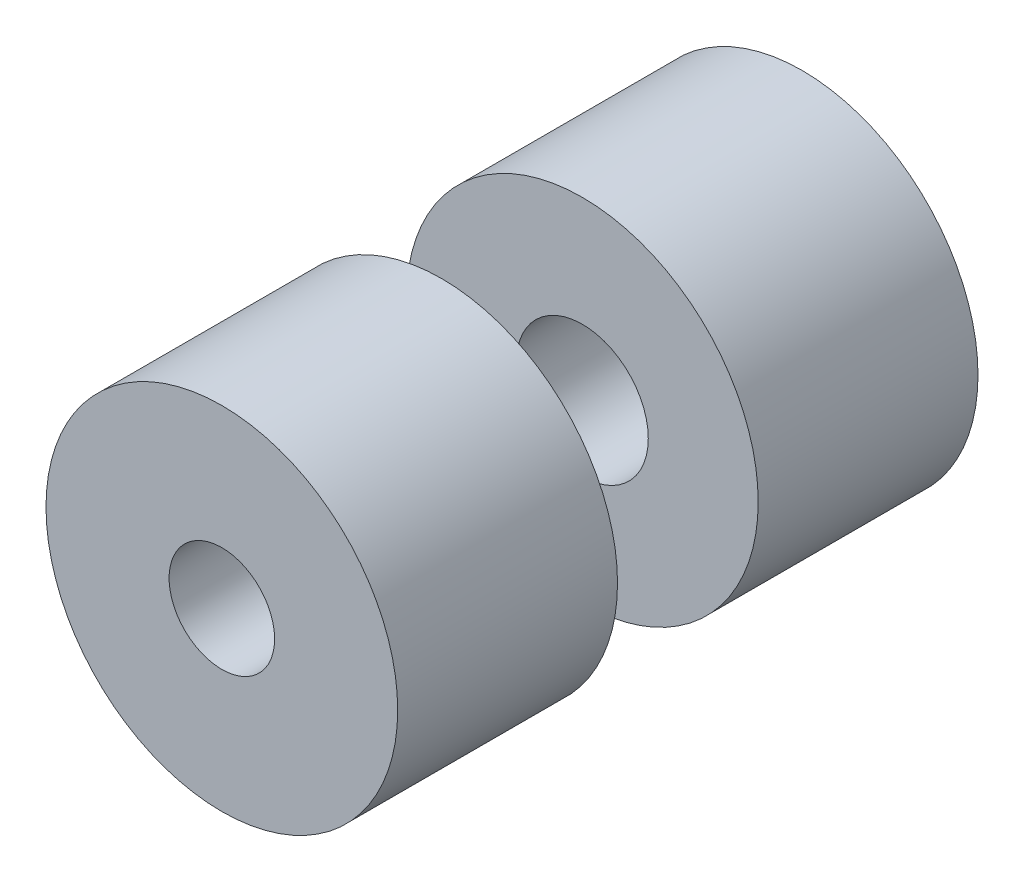
ISO-10303-21;
HEADER;
FILE_DESCRIPTION(('STEP AP214'),'2;1');
FILE_NAME('part.step','',(''),(''),'','','');
FILE_SCHEMA(('AUTOMOTIVE_DESIGN { 1 0 10303 214 1 1 1 1 }'));
ENDSEC;
DATA;
#1=APPLICATION_CONTEXT('core data for automotive mechanical design processes');
#2=APPLICATION_PROTOCOL_DEFINITION('international standard','automotive_design',2000,#1);
#3=PRODUCT_CONTEXT('',#1,'mechanical');
#4=PRODUCT('Part','Part','',(#3));
#5=PRODUCT_RELATED_PRODUCT_CATEGORY('part','',(#4));
#6=PRODUCT_DEFINITION_FORMATION('','',#4);
#7=PRODUCT_DEFINITION_CONTEXT('part definition',#1,'design');
#8=PRODUCT_DEFINITION('design','',#6,#7);
#9=PRODUCT_DEFINITION_SHAPE('','',#8);
#10=(LENGTH_UNIT() NAMED_UNIT(*) SI_UNIT(.MILLI.,.METRE.));
#11=(NAMED_UNIT(*) PLANE_ANGLE_UNIT() SI_UNIT($,.RADIAN.));
#12=(NAMED_UNIT(*) SI_UNIT($,.STERADIAN.) SOLID_ANGLE_UNIT());
#13=UNCERTAINTY_MEASURE_WITH_UNIT(LENGTH_MEASURE(1.E-05),#10,'distance_accuracy_value','');
#14=(GEOMETRIC_REPRESENTATION_CONTEXT(3) GLOBAL_UNCERTAINTY_ASSIGNED_CONTEXT((#13)) GLOBAL_UNIT_ASSIGNED_CONTEXT((#10,
#11,#12)) REPRESENTATION_CONTEXT('',''));
#15=CARTESIAN_POINT('',(0.,0.,0.));
#16=DIRECTION('',(0.,0.,1.));
#17=DIRECTION('',(1.,0.,0.));
#18=AXIS2_PLACEMENT_3D('',#15,#16,#17);
#19=CARTESIAN_POINT('',(0.,0.,-9.));
#20=DIRECTION('',(0.,0.,1.));
#21=DIRECTION('',(1.,0.,0.));
#22=AXIS2_PLACEMENT_3D('',#19,#20,#21);
#23=CYLINDRICAL_SURFACE('',#22,7.5);
#24=CARTESIAN_POINT('',(0.,0.,-80.));
#25=DIRECTION('',(0.,0.,1.));
#26=DIRECTION('',(1.,0.,0.));
#27=AXIS2_PLACEMENT_3D('',#24,#25,#26);
#28=CIRCLE('',#27,7.5);
#29=CARTESIAN_POINT('',(7.5,0.,-80.));
#30=VERTEX_POINT('',#29);
#31=EDGE_CURVE('E61',#30,#30,#28,.T.);
#32=ORIENTED_EDGE('',*,*,#31,.F.);
#33=EDGE_LOOP('',(#32));
#34=FACE_BOUND('',#33,.T.);
#35=CARTESIAN_POINT('',(0.,0.,-55.));
#36=DIRECTION('',(0.,0.,1.));
#37=DIRECTION('',(1.,0.,0.));
#38=AXIS2_PLACEMENT_3D('',#35,#36,#37);
#39=CIRCLE('',#38,7.5);
#40=CARTESIAN_POINT('',(7.5,0.,-55.));
#41=VERTEX_POINT('',#40);
#42=EDGE_CURVE('E11',#41,#41,#39,.T.);
#43=ORIENTED_EDGE('',*,*,#42,.T.);
#44=EDGE_LOOP('',(#43));
#45=FACE_BOUND('',#44,.T.);
#46=ADVANCED_FACE('F47',(#34,#45),#23,.F.);
#47=CARTESIAN_POINT('',(0.,7.5,-55.));
#48=DIRECTION('',(0.,0.,-1.));
#49=DIRECTION('',(-1.,0.,0.));
#50=AXIS2_PLACEMENT_3D('',#47,#48,#49);
#51=PLANE('',#50);
#52=ORIENTED_EDGE('',*,*,#42,.F.);
#53=EDGE_LOOP('',(#52));
#54=FACE_BOUND('',#53,.T.);
#55=CARTESIAN_POINT('',(0.,0.,-55.));
#56=DIRECTION('',(0.,0.,1.));
#57=DIRECTION('',(1.,0.,0.));
#58=AXIS2_PLACEMENT_3D('',#55,#56,#57);
#59=CIRCLE('',#58,20.);
#60=CARTESIAN_POINT('',(20.,0.,-55.));
#61=VERTEX_POINT('',#60);
#62=EDGE_CURVE('E53',#61,#61,#59,.T.);
#63=ORIENTED_EDGE('',*,*,#62,.T.);
#64=EDGE_LOOP('',(#63));
#65=FACE_BOUND('',#64,.T.);
#66=ADVANCED_FACE('F70',(#54,#65),#51,.F.);
#67=CARTESIAN_POINT('',(0.,0.,-9.));
#68=DIRECTION('',(0.,0.,1.));
#69=DIRECTION('',(1.,0.,0.));
#70=AXIS2_PLACEMENT_3D('',#67,#68,#69);
#71=CYLINDRICAL_SURFACE('',#70,20.);
#72=ORIENTED_EDGE('',*,*,#62,.F.);
#73=EDGE_LOOP('',(#72));
#74=FACE_BOUND('',#73,.T.);
#75=CARTESIAN_POINT('',(0.,0.,-80.));
#76=DIRECTION('',(0.,0.,1.));
#77=DIRECTION('',(1.,0.,0.));
#78=AXIS2_PLACEMENT_3D('',#75,#76,#77);
#79=CIRCLE('',#78,20.);
#80=CARTESIAN_POINT('',(20.,0.,-80.));
#81=VERTEX_POINT('',#80);
#82=EDGE_CURVE('E57',#81,#81,#79,.T.);
#83=ORIENTED_EDGE('',*,*,#82,.T.);
#84=EDGE_LOOP('',(#83));
#85=FACE_BOUND('',#84,.T.);
#86=ADVANCED_FACE('F74',(#74,#85),#71,.T.);
#87=CARTESIAN_POINT('',(0.,20.,-80.));
#88=DIRECTION('',(0.,0.,1.));
#89=DIRECTION('',(1.,0.,0.));
#90=AXIS2_PLACEMENT_3D('',#87,#88,#89);
#91=PLANE('',#90);
#92=ORIENTED_EDGE('',*,*,#82,.F.);
#93=EDGE_LOOP('',(#92));
#94=FACE_BOUND('',#93,.T.);
#95=ORIENTED_EDGE('',*,*,#31,.T.);
#96=EDGE_LOOP('',(#95));
#97=FACE_BOUND('',#96,.T.);
#98=ADVANCED_FACE('F67',(#94,#97),#91,.F.);
#99=CLOSED_SHELL('',(#46,#66,#86,#98));
#100=MANIFOLD_SOLID_BREP('B2',#99);
#101=CARTESIAN_POINT('',(0.,0.,-9.));
#102=DIRECTION('',(0.,0.,1.));
#103=DIRECTION('',(1.,0.,0.));
#104=AXIS2_PLACEMENT_3D('',#101,#102,#103);
#105=CYLINDRICAL_SURFACE('',#104,6.);
#106=CARTESIAN_POINT('',(0.,0.,-39.));
#107=DIRECTION('',(0.,0.,1.));
#108=DIRECTION('',(1.,0.,0.));
#109=AXIS2_PLACEMENT_3D('',#106,#107,#108);
#110=CIRCLE('',#109,6.);
#111=CARTESIAN_POINT('',(6.,0.,-39.));
#112=VERTEX_POINT('',#111);
#113=EDGE_CURVE('E131',#112,#112,#110,.T.);
#114=ORIENTED_EDGE('',*,*,#113,.F.);
#115=EDGE_LOOP('',(#114));
#116=FACE_BOUND('',#115,.T.);
#117=CARTESIAN_POINT('',(0.,0.,-14.));
#118=DIRECTION('',(0.,0.,1.));
#119=DIRECTION('',(1.,0.,0.));
#120=AXIS2_PLACEMENT_3D('',#117,#118,#119);
#121=CIRCLE('',#120,6.);
#122=CARTESIAN_POINT('',(6.,0.,-14.));
#123=VERTEX_POINT('',#122);
#124=EDGE_CURVE('E46',#123,#123,#121,.T.);
#125=ORIENTED_EDGE('',*,*,#124,.T.);
#126=EDGE_LOOP('',(#125));
#127=FACE_BOUND('',#126,.T.);
#128=ADVANCED_FACE('F117',(#116,#127),#105,.F.);
#129=CARTESIAN_POINT('',(0.,6.,-14.));
#130=DIRECTION('',(0.,0.,-1.));
#131=DIRECTION('',(-1.,0.,0.));
#132=AXIS2_PLACEMENT_3D('',#129,#130,#131);
#133=PLANE('',#132);
#134=ORIENTED_EDGE('',*,*,#124,.F.);
#135=EDGE_LOOP('',(#134));
#136=FACE_BOUND('',#135,.T.);
#137=CARTESIAN_POINT('',(0.,0.,-14.));
#138=DIRECTION('',(0.,0.,1.));
#139=DIRECTION('',(1.,0.,0.));
#140=AXIS2_PLACEMENT_3D('',#137,#138,#139);
#141=CIRCLE('',#140,20.);
#142=CARTESIAN_POINT('',(20.,0.,-14.));
#143=VERTEX_POINT('',#142);
#144=EDGE_CURVE('E123',#143,#143,#141,.T.);
#145=ORIENTED_EDGE('',*,*,#144,.T.);
#146=EDGE_LOOP('',(#145));
#147=FACE_BOUND('',#146,.T.);
#148=ADVANCED_FACE('F140',(#136,#147),#133,.F.);
#149=CARTESIAN_POINT('',(0.,0.,-9.));
#150=DIRECTION('',(0.,0.,1.));
#151=DIRECTION('',(1.,0.,0.));
#152=AXIS2_PLACEMENT_3D('',#149,#150,#151);
#153=CYLINDRICAL_SURFACE('',#152,20.);
#154=ORIENTED_EDGE('',*,*,#144,.F.);
#155=EDGE_LOOP('',(#154));
#156=FACE_BOUND('',#155,.T.);
#157=CARTESIAN_POINT('',(0.,0.,-39.));
#158=DIRECTION('',(0.,0.,1.));
#159=DIRECTION('',(1.,0.,0.));
#160=AXIS2_PLACEMENT_3D('',#157,#158,#159);
#161=CIRCLE('',#160,20.);
#162=CARTESIAN_POINT('',(20.,0.,-39.));
#163=VERTEX_POINT('',#162);
#164=EDGE_CURVE('E127',#163,#163,#161,.T.);
#165=ORIENTED_EDGE('',*,*,#164,.T.);
#166=EDGE_LOOP('',(#165));
#167=FACE_BOUND('',#166,.T.);
#168=ADVANCED_FACE('F144',(#156,#167),#153,.T.);
#169=CARTESIAN_POINT('',(0.,20.,-39.));
#170=DIRECTION('',(0.,0.,1.));
#171=DIRECTION('',(1.,0.,0.));
#172=AXIS2_PLACEMENT_3D('',#169,#170,#171);
#173=PLANE('',#172);
#174=ORIENTED_EDGE('',*,*,#164,.F.);
#175=EDGE_LOOP('',(#174));
#176=FACE_BOUND('',#175,.T.);
#177=ORIENTED_EDGE('',*,*,#113,.T.);
#178=EDGE_LOOP('',(#177));
#179=FACE_BOUND('',#178,.T.);
#180=ADVANCED_FACE('F137',(#176,#179),#173,.F.);
#181=CLOSED_SHELL('',(#128,#148,#168,#180));
#182=MANIFOLD_SOLID_BREP('B6',#181);
#183=ADVANCED_BREP_SHAPE_REPRESENTATION('',(#18,#100,#182),#14);
#184=SHAPE_DEFINITION_REPRESENTATION(#9,#183);
ENDSEC;
END-ISO-10303-21;
